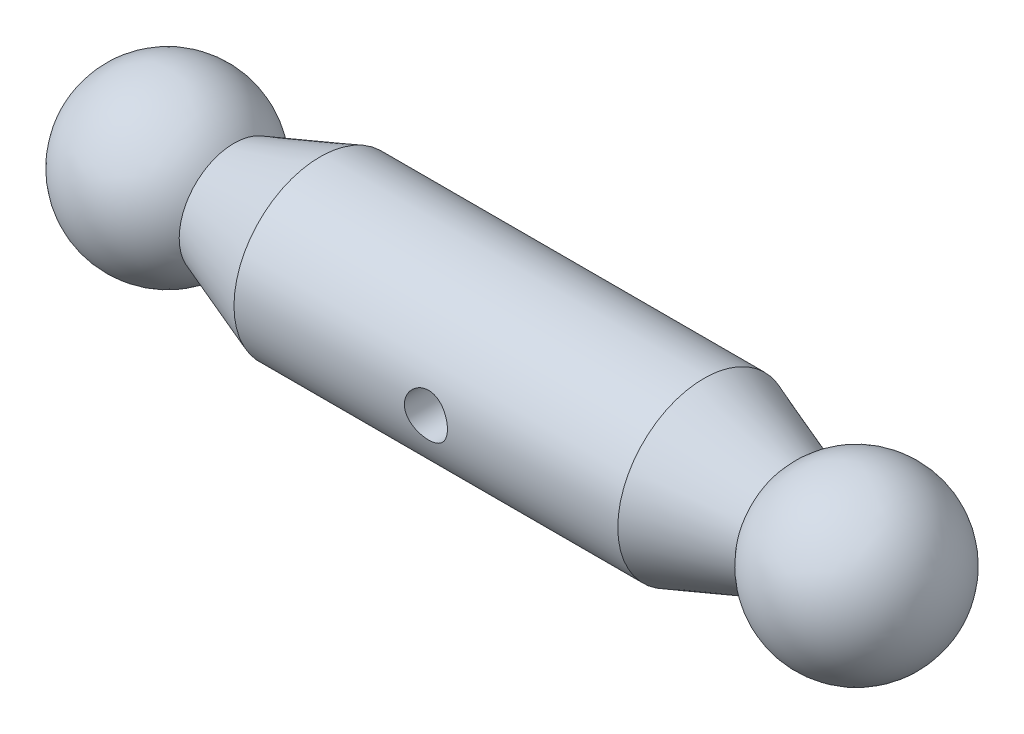
ISO-10303-21;
HEADER;
FILE_DESCRIPTION(('STEP AP214'),'2;1');
FILE_NAME('part.step','',(''),(''),'','','');
FILE_SCHEMA(('AUTOMOTIVE_DESIGN { 1 0 10303 214 1 1 1 1 }'));
ENDSEC;
DATA;
#1=APPLICATION_CONTEXT('core data for automotive mechanical design processes');
#2=APPLICATION_PROTOCOL_DEFINITION('international standard','automotive_design',2000,#1);
#3=PRODUCT_CONTEXT('',#1,'mechanical');
#4=PRODUCT('Part','Part','',(#3));
#5=PRODUCT_RELATED_PRODUCT_CATEGORY('part','',(#4));
#6=PRODUCT_DEFINITION_FORMATION('','',#4);
#7=PRODUCT_DEFINITION_CONTEXT('part definition',#1,'design');
#8=PRODUCT_DEFINITION('design','',#6,#7);
#9=PRODUCT_DEFINITION_SHAPE('','',#8);
#10=(LENGTH_UNIT() NAMED_UNIT(*) SI_UNIT(.MILLI.,.METRE.));
#11=(NAMED_UNIT(*) PLANE_ANGLE_UNIT() SI_UNIT($,.RADIAN.));
#12=(NAMED_UNIT(*) SI_UNIT($,.STERADIAN.) SOLID_ANGLE_UNIT());
#13=UNCERTAINTY_MEASURE_WITH_UNIT(LENGTH_MEASURE(1.E-05),#10,'distance_accuracy_value','');
#14=(GEOMETRIC_REPRESENTATION_CONTEXT(3) GLOBAL_UNCERTAINTY_ASSIGNED_CONTEXT((#13)) GLOBAL_UNIT_ASSIGNED_CONTEXT((#10,
#11,#12)) REPRESENTATION_CONTEXT('',''));
#15=CARTESIAN_POINT('',(0.,0.,0.));
#16=DIRECTION('',(0.,0.,1.));
#17=DIRECTION('',(1.,0.,0.));
#18=AXIS2_PLACEMENT_3D('',#15,#16,#17);
#19=CARTESIAN_POINT('',(-32.,0.,0.));
#20=DIRECTION('',(-1.,0.,0.));
#21=DIRECTION('',(0.,1.,0.));
#22=AXIS2_PLACEMENT_3D('',#19,#20,#21);
#23=SPHERICAL_SURFACE('',#22,8.);
#24=CARTESIAN_POINT('',(-25.8266838105894,0.,0.));
#25=DIRECTION('',(-1.,0.,0.));
#26=DIRECTION('',(0.,0.,1.));
#27=AXIS2_PLACEMENT_3D('',#24,#25,#26);
#28=CIRCLE('',#27,5.08823812587038);
#29=CARTESIAN_POINT('',(-25.8266838105894,0.,5.08823812587038));
#30=VERTEX_POINT('',#29);
#31=EDGE_CURVE('E395',#30,#30,#28,.T.);
#32=ORIENTED_EDGE('',*,*,#31,.T.);
#33=EDGE_LOOP('',(#32));
#34=FACE_BOUND('',#33,.T.);
#35=ADVANCED_FACE('F346',(#34),#23,.T.);
#36=CARTESIAN_POINT('',(32.,0.,0.));
#37=DIRECTION('',(-1.,0.,0.));
#38=DIRECTION('',(0.,-1.,0.));
#39=AXIS2_PLACEMENT_3D('',#36,#37,#38);
#40=SPHERICAL_SURFACE('',#39,8.);
#41=CARTESIAN_POINT('',(25.8266838105894,0.,0.));
#42=DIRECTION('',(-1.,0.,0.));
#43=DIRECTION('',(0.,0.,1.));
#44=AXIS2_PLACEMENT_3D('',#41,#42,#43);
#45=CIRCLE('',#44,5.08823812587038);
#46=CARTESIAN_POINT('',(25.8266838105894,0.,5.08823812587038));
#47=VERTEX_POINT('',#46);
#48=EDGE_CURVE('E10',#47,#47,#45,.T.);
#49=ORIENTED_EDGE('',*,*,#48,.F.);
#50=EDGE_LOOP('',(#49));
#51=FACE_BOUND('',#50,.T.);
#52=ADVANCED_FACE('F389',(#51),#40,.T.);
#53=CARTESIAN_POINT('',(25.8266838105894,0.,0.));
#54=DIRECTION('',(-1.,0.,0.));
#55=DIRECTION('',(0.,0.,1.));
#56=AXIS2_PLACEMENT_3D('',#53,#54,#55);
#57=CONICAL_SURFACE('',#56,5.08823812587038,0.349065850398867);
#58=CARTESIAN_POINT('',(17.8266838105894,0.,0.));
#59=DIRECTION('',(-1.,0.,0.));
#60=DIRECTION('',(0.,0.,1.));
#61=AXIS2_PLACEMENT_3D('',#58,#59,#60);
#62=CIRCLE('',#61,8.00000000000001);
#63=CARTESIAN_POINT('',(17.8266838105894,0.,8.00000000000001));
#64=VERTEX_POINT('',#63);
#65=EDGE_CURVE('E357',#64,#64,#62,.T.);
#66=ORIENTED_EDGE('',*,*,#65,.F.);
#67=EDGE_LOOP('',(#66));
#68=FACE_BOUND('',#67,.T.);
#69=ORIENTED_EDGE('',*,*,#48,.T.);
#70=EDGE_LOOP('',(#69));
#71=FACE_BOUND('',#70,.T.);
#72=ADVANCED_FACE('F384',(#68,#71),#57,.T.);
#73=CARTESIAN_POINT('',(-66.1293467336683,0.,0.));
#74=DIRECTION('',(-1.,0.,0.));
#75=DIRECTION('',(0.,0.,1.));
#76=AXIS2_PLACEMENT_3D('',#73,#74,#75);
#77=CYLINDRICAL_SURFACE('',#76,8.00000000000001);
#78=CARTESIAN_POINT('',(2.,0.,8.00000000000001));
#79=CARTESIAN_POINT('',(1.99999689901579,-0.110501451559641,7.9999981315735));
#80=CARTESIAN_POINT('',(1.99081126563495,-0.221037543774351,7.99768770842436));
#81=CARTESIAN_POINT('',(1.95436646492399,-0.438941765027377,7.98869485106526));
#82=CARTESIAN_POINT('',(1.92709705394953,-0.546308062494319,7.98200993893302));
#83=CARTESIAN_POINT('',(1.85541432871722,-0.754694496243436,7.96500835109377));
#84=CARTESIAN_POINT('',(1.81102160171297,-0.855722084573336,7.95469603789412));
#85=CARTESIAN_POINT('',(1.70642481327354,-1.04889617587257,7.93153791743496));
#86=CARTESIAN_POINT('',(1.64622021850804,-1.14104237913168,7.91869202472209));
#87=CARTESIAN_POINT('',(1.51039894712776,-1.31573590306789,7.89156551455592));
#88=CARTESIAN_POINT('',(1.43451790005459,-1.39807425341474,7.87726276197502));
#89=CARTESIAN_POINT('',(1.27006372678795,-1.54899856960443,7.84898160157249));
#90=CARTESIAN_POINT('',(1.18148916940408,-1.61758298259892,7.83500323053157));
#91=CARTESIAN_POINT('',(0.992539697684012,-1.74003539039863,7.80873034264225));
#92=CARTESIAN_POINT('',(0.892009025588362,-1.79366962123352,7.79646392619749));
#93=CARTESIAN_POINT('',(0.683002117786619,-1.88319587806766,7.77532659757356));
#94=CARTESIAN_POINT('',(0.574527155557313,-1.91909074058685,7.76645514259225));
#95=CARTESIAN_POINT('',(0.355008669064454,-1.97140644907302,7.75333968928431));
#96=CARTESIAN_POINT('',(0.24406013861601,-1.98820302444274,7.74900654662682));
#97=CARTESIAN_POINT('',(0.0208419080008726,-2.00301570008854,7.74519149946123));
#98=CARTESIAN_POINT('',(-0.0914275742561829,-2.00103485575748,7.74570880570572));
#99=CARTESIAN_POINT('',(-0.311221076993804,-1.97864869951961,7.75145607355757));
#100=CARTESIAN_POINT('',(-0.418794161953774,-1.95869112025418,7.75657150676392));
#101=CARTESIAN_POINT('',(-0.629014734548078,-1.90163224920399,7.77075612894759));
#102=CARTESIAN_POINT('',(-0.731661870705229,-1.86452973609252,7.77982559958985));
#103=CARTESIAN_POINT('',(-0.93031735500284,-1.77385263724958,7.80100151874213));
#104=CARTESIAN_POINT('',(-1.02624822905276,-1.72011555631056,7.81313769959755));
#105=CARTESIAN_POINT('',(-1.20789161300909,-1.59780836801993,7.83906281127989));
#106=CARTESIAN_POINT('',(-1.29360233075634,-1.52923566507845,7.85285203112838));
#107=CARTESIAN_POINT('',(-1.45493815425921,-1.37688456624163,7.88101174053189));
#108=CARTESIAN_POINT('',(-1.53020598674847,-1.29272834422115,7.89538759304002));
#109=CARTESIAN_POINT('',(-1.6656283232852,-1.11281589000493,7.92274620771676));
#110=CARTESIAN_POINT('',(-1.72578236568475,-1.01705930361059,7.93572892732544));
#111=CARTESIAN_POINT('',(-1.82940078163251,-0.816154518241855,7.95890309458921));
#112=CARTESIAN_POINT('',(-1.87280712033924,-0.710975190944831,7.96908480170304));
#113=CARTESIAN_POINT('',(-1.94122307427943,-0.49450134419051,7.98543889321889));
#114=CARTESIAN_POINT('',(-1.96623620855752,-0.383207998867313,7.99161204452374));
#115=CARTESIAN_POINT('',(-1.99661008741178,-0.160719960520035,7.99913999028501));
#116=CARTESIAN_POINT('',(-2.0024573681004,-0.0495956266509458,8.00061404677706));
#117=CARTESIAN_POINT('',(-1.99566799725935,0.172043833068678,7.99891739752602));
#118=CARTESIAN_POINT('',(-1.98303300960116,0.282559012859461,7.99574710989129));
#119=CARTESIAN_POINT('',(-1.94003878881149,0.498152358368656,7.98519441503143));
#120=CARTESIAN_POINT('',(-1.90994498203068,0.603286825291673,7.97787512247749));
#121=CARTESIAN_POINT('',(-1.83319055462874,0.807009723270016,7.95984942178846));
#122=CARTESIAN_POINT('',(-1.78652826091577,0.905597492043513,7.94914267159857));
#123=CARTESIAN_POINT('',(-1.6770184948337,1.0953641792398,7.92524410568415));
#124=CARTESIAN_POINT('',(-1.61389851680432,1.18638058911444,7.91201156489244));
#125=CARTESIAN_POINT('',(-1.47361345493737,1.35670215152433,7.88459345583227));
#126=CARTESIAN_POINT('',(-1.39644594717746,1.43600527863068,7.87040772335607));
#127=CARTESIAN_POINT('',(-1.22799738554071,1.58265409076364,7.84225275947695));
#128=CARTESIAN_POINT('',(-1.13641639599677,1.64965849016271,7.82829738916375));
#129=CARTESIAN_POINT('',(-0.943023154045709,1.7673476786836,7.80257171169652));
#130=CARTESIAN_POINT('',(-0.841211356053661,1.81803319221058,7.79080130756036));
#131=CARTESIAN_POINT('',(-0.630792370115895,1.90126856081239,7.77090792979554));
#132=CARTESIAN_POINT('',(-0.522229828874654,1.93392586220542,7.76276340389208));
#133=CARTESIAN_POINT('',(-0.300920482814521,1.98046087993837,7.75102325453579));
#134=CARTESIAN_POINT('',(-0.188174598623345,1.99434270330488,7.74742663626582));
#135=CARTESIAN_POINT('',(0.0348280318069375,2.00271812044533,7.7452653493861));
#136=CARTESIAN_POINT('',(0.145063246832974,1.99775719704016,7.74655910304352));
#137=CARTESIAN_POINT('',(0.363071851557308,1.96983637108382,7.75370545343791));
#138=CARTESIAN_POINT('',(0.470845290684868,1.94687683024903,7.7595579585581));
#139=CARTESIAN_POINT('',(0.680277945420545,1.88390842592373,7.77508347576964));
#140=CARTESIAN_POINT('',(0.781969740320278,1.84400187290717,7.78473353648413));
#141=CARTESIAN_POINT('',(0.977287176951586,1.74835321814009,7.80677007633106));
#142=CARTESIAN_POINT('',(1.07091169758256,1.69260892004558,7.81915693494365));
#143=CARTESIAN_POINT('',(1.25007283866936,1.56515699818285,7.8456751235135));
#144=CARTESIAN_POINT('',(1.33533476456528,1.493070883883,7.8598435310901));
#145=CARTESIAN_POINT('',(1.49272939306054,1.33571916158631,7.88810702995048));
#146=CARTESIAN_POINT('',(1.56485897348396,1.25045042834819,7.90220210302747));
#147=CARTESIAN_POINT('',(1.69521507808614,1.06729011560345,7.92903540863551));
#148=CARTESIAN_POINT('',(1.75316615156211,0.969197896421848,7.94174444487825));
#149=CARTESIAN_POINT('',(1.85166328392071,0.764354746013967,7.96406566633492));
#150=CARTESIAN_POINT('',(1.89222181419805,0.657610084582318,7.97368006933042));
#151=CARTESIAN_POINT('',(1.94876244043954,0.459213670991294,7.98730746087389));
#152=CARTESIAN_POINT('',(1.96793499073791,0.36850689454409,7.99203446736921));
#153=CARTESIAN_POINT('',(1.99355459149592,0.18520809538171,7.99838140309265));
#154=CARTESIAN_POINT('',(2.00000259907373,0.0926162149901548,8.00000156601193));
#155=CARTESIAN_POINT('',(2.,0.,8.00000000000001));
#156=B_SPLINE_CURVE_WITH_KNOTS('',3,(#78,#79,#80,#81,#82,#83,#84,#85,#86,#87,#88,#89,#90,#91,
#92,#93,#94,#95,#96,#97,#98,#99,#100,#101,#102,#103,#104,#105,#106,#107,#108,#109,#110,#111,
#112,#113,#114,#115,#116,#117,#118,#119,#120,#121,#122,#123,#124,#125,#126,#127,#128,#129,#130,
#131,#132,#133,#134,#135,#136,#137,#138,#139,#140,#141,#142,#143,#144,#145,#146,#147,#148,#149,
#150,#151,#152,#153,#154,#155),.UNSPECIFIED.,.T.,.F.,(4,2,2,2,2,2,2,2,2,2,2,2,2,2,2,2,2,2,2,2,2,
2,2,2,2,2,2,2,2,2,2,2,2,2,2,2,2,2,4),(0.,0.33116494996252,0.662517650351866,0.993473203048141,
1.32443992022577,1.66152580582852,1.99864972773416,2.34078196727742,2.68285948225824,
3.01808393468093,3.3532538415469,3.68029996013785,4.00736937959146,4.337740371696,
4.66816921119311,5.00802001296454,5.34788119415424,5.6889097201658,6.02987298255951,
6.36211078603463,6.69431868154751,7.02160366023144,7.34892169767481,7.68204783424897,
8.01523150681786,8.35659345610395,8.69794025003772,9.03723006156476,9.37644564340971,
9.70591707202577,10.0353818794581,10.3628853408369,10.6904342418696,11.0265276855097,
11.3627009303165,11.7049624733721,12.0469781843289,12.3245632392729,12.6021274139515),.UNSPECIFIED.);
#157=CARTESIAN_POINT('',(2.,0.,8.00000000000001));
#158=VERTEX_POINT('',#157);
#159=EDGE_CURVE('E349',#158,#158,#156,.T.);
#160=ORIENTED_EDGE('',*,*,#159,.T.);
#161=EDGE_LOOP('',(#160));
#162=FACE_BOUND('',#161,.T.);
#163=CARTESIAN_POINT('',(2.,0.,-8.00000000000001));
#164=CARTESIAN_POINT('',(1.99999689901579,0.110501451559641,-7.9999981315735));
#165=CARTESIAN_POINT('',(1.99081126563495,0.221037543774351,-7.99768770842436));
#166=CARTESIAN_POINT('',(1.95436646492399,0.438941765027377,-7.98869485106526));
#167=CARTESIAN_POINT('',(1.92709705394953,0.546308062494319,-7.98200993893302));
#168=CARTESIAN_POINT('',(1.85541432871722,0.754694496243436,-7.96500835109377));
#169=CARTESIAN_POINT('',(1.81102160171297,0.855722084573336,-7.95469603789412));
#170=CARTESIAN_POINT('',(1.70642481327354,1.04889617587257,-7.93153791743496));
#171=CARTESIAN_POINT('',(1.64622021850804,1.14104237913168,-7.91869202472209));
#172=CARTESIAN_POINT('',(1.51039894712776,1.31573590306789,-7.89156551455592));
#173=CARTESIAN_POINT('',(1.43451790005459,1.39807425341474,-7.87726276197502));
#174=CARTESIAN_POINT('',(1.27006372678795,1.54899856960443,-7.84898160157249));
#175=CARTESIAN_POINT('',(1.18148916940408,1.61758298259892,-7.83500323053157));
#176=CARTESIAN_POINT('',(0.992539697684012,1.74003539039863,-7.80873034264225));
#177=CARTESIAN_POINT('',(0.892009025588362,1.79366962123352,-7.79646392619749));
#178=CARTESIAN_POINT('',(0.683002117786619,1.88319587806766,-7.77532659757356));
#179=CARTESIAN_POINT('',(0.574527155557313,1.91909074058685,-7.76645514259225));
#180=CARTESIAN_POINT('',(0.355008669064454,1.97140644907302,-7.75333968928431));
#181=CARTESIAN_POINT('',(0.24406013861601,1.98820302444274,-7.74900654662682));
#182=CARTESIAN_POINT('',(0.0208419080008726,2.00301570008854,-7.74519149946123));
#183=CARTESIAN_POINT('',(-0.0914275742561829,2.00103485575748,-7.74570880570572));
#184=CARTESIAN_POINT('',(-0.311221076993804,1.97864869951961,-7.75145607355757));
#185=CARTESIAN_POINT('',(-0.418794161953774,1.95869112025418,-7.75657150676392));
#186=CARTESIAN_POINT('',(-0.629014734548078,1.90163224920399,-7.77075612894759));
#187=CARTESIAN_POINT('',(-0.731661870705229,1.86452973609252,-7.77982559958985));
#188=CARTESIAN_POINT('',(-0.93031735500284,1.77385263724958,-7.80100151874213));
#189=CARTESIAN_POINT('',(-1.02624822905276,1.72011555631056,-7.81313769959755));
#190=CARTESIAN_POINT('',(-1.20789161300909,1.59780836801993,-7.83906281127989));
#191=CARTESIAN_POINT('',(-1.29360233075634,1.52923566507845,-7.85285203112838));
#192=CARTESIAN_POINT('',(-1.45493815425921,1.37688456624163,-7.88101174053189));
#193=CARTESIAN_POINT('',(-1.53020598674847,1.29272834422115,-7.89538759304002));
#194=CARTESIAN_POINT('',(-1.6656283232852,1.11281589000493,-7.92274620771676));
#195=CARTESIAN_POINT('',(-1.72578236568475,1.01705930361059,-7.93572892732544));
#196=CARTESIAN_POINT('',(-1.82940078163251,0.816154518241855,-7.95890309458921));
#197=CARTESIAN_POINT('',(-1.87280712033924,0.710975190944831,-7.96908480170304));
#198=CARTESIAN_POINT('',(-1.94122307427943,0.49450134419051,-7.98543889321889));
#199=CARTESIAN_POINT('',(-1.96623620855752,0.383207998867313,-7.99161204452374));
#200=CARTESIAN_POINT('',(-1.99661008741178,0.160719960520035,-7.99913999028501));
#201=CARTESIAN_POINT('',(-2.0024573681004,0.0495956266509458,-8.00061404677706));
#202=CARTESIAN_POINT('',(-1.99566799725935,-0.172043833068678,-7.99891739752602));
#203=CARTESIAN_POINT('',(-1.98303300960116,-0.282559012859461,-7.99574710989129));
#204=CARTESIAN_POINT('',(-1.94003878881149,-0.498152358368656,-7.98519441503143));
#205=CARTESIAN_POINT('',(-1.90994498203068,-0.603286825291673,-7.97787512247749));
#206=CARTESIAN_POINT('',(-1.83319055462874,-0.807009723270016,-7.95984942178846));
#207=CARTESIAN_POINT('',(-1.78652826091577,-0.905597492043513,-7.94914267159857));
#208=CARTESIAN_POINT('',(-1.6770184948337,-1.0953641792398,-7.92524410568415));
#209=CARTESIAN_POINT('',(-1.61389851680432,-1.18638058911444,-7.91201156489244));
#210=CARTESIAN_POINT('',(-1.47361345493737,-1.35670215152433,-7.88459345583227));
#211=CARTESIAN_POINT('',(-1.39644594717746,-1.43600527863068,-7.87040772335607));
#212=CARTESIAN_POINT('',(-1.22799738554071,-1.58265409076364,-7.84225275947695));
#213=CARTESIAN_POINT('',(-1.13641639599677,-1.64965849016271,-7.82829738916375));
#214=CARTESIAN_POINT('',(-0.943023154045709,-1.7673476786836,-7.80257171169652));
#215=CARTESIAN_POINT('',(-0.841211356053661,-1.81803319221058,-7.79080130756036));
#216=CARTESIAN_POINT('',(-0.630792370115895,-1.90126856081239,-7.77090792979554));
#217=CARTESIAN_POINT('',(-0.522229828874654,-1.93392586220542,-7.76276340389208));
#218=CARTESIAN_POINT('',(-0.300920482814521,-1.98046087993837,-7.75102325453579));
#219=CARTESIAN_POINT('',(-0.188174598623345,-1.99434270330488,-7.74742663626582));
#220=CARTESIAN_POINT('',(0.0348280318069375,-2.00271812044533,-7.7452653493861));
#221=CARTESIAN_POINT('',(0.145063246832974,-1.99775719704016,-7.74655910304352));
#222=CARTESIAN_POINT('',(0.363071851557308,-1.96983637108382,-7.75370545343791));
#223=CARTESIAN_POINT('',(0.470845290684868,-1.94687683024903,-7.7595579585581));
#224=CARTESIAN_POINT('',(0.680277945420545,-1.88390842592373,-7.77508347576964));
#225=CARTESIAN_POINT('',(0.781969740320278,-1.84400187290717,-7.78473353648413));
#226=CARTESIAN_POINT('',(0.977287176951586,-1.74835321814009,-7.80677007633106));
#227=CARTESIAN_POINT('',(1.07091169758256,-1.69260892004558,-7.81915693494365));
#228=CARTESIAN_POINT('',(1.25007283866936,-1.56515699818285,-7.8456751235135));
#229=CARTESIAN_POINT('',(1.33533476456528,-1.493070883883,-7.8598435310901));
#230=CARTESIAN_POINT('',(1.49272939306054,-1.33571916158631,-7.88810702995048));
#231=CARTESIAN_POINT('',(1.56485897348396,-1.25045042834819,-7.90220210302747));
#232=CARTESIAN_POINT('',(1.69521507808614,-1.06729011560345,-7.92903540863551));
#233=CARTESIAN_POINT('',(1.75316615156211,-0.969197896421848,-7.94174444487825));
#234=CARTESIAN_POINT('',(1.85166328392071,-0.764354746013967,-7.96406566633492));
#235=CARTESIAN_POINT('',(1.89222181419805,-0.657610084582318,-7.97368006933042));
#236=CARTESIAN_POINT('',(1.94876244043954,-0.459213670991294,-7.98730746087389));
#237=CARTESIAN_POINT('',(1.96793499073791,-0.36850689454409,-7.99203446736921));
#238=CARTESIAN_POINT('',(1.99355459149592,-0.18520809538171,-7.99838140309265));
#239=CARTESIAN_POINT('',(2.00000259907373,-0.0926162149901548,-8.00000156601193));
#240=CARTESIAN_POINT('',(2.,0.,-8.00000000000001));
#241=B_SPLINE_CURVE_WITH_KNOTS('',3,(#163,#164,#165,#166,#167,#168,#169,#170,#171,#172,#173,
#174,#175,#176,#177,#178,#179,#180,#181,#182,#183,#184,#185,#186,#187,#188,#189,#190,#191,#192,
#193,#194,#195,#196,#197,#198,#199,#200,#201,#202,#203,#204,#205,#206,#207,#208,#209,#210,#211,
#212,#213,#214,#215,#216,#217,#218,#219,#220,#221,#222,#223,#224,#225,#226,#227,#228,#229,#230,
#231,#232,#233,#234,#235,#236,#237,#238,#239,#240),.UNSPECIFIED.,.T.,.F.,(4,2,2,2,2,2,2,2,2,2,2,
2,2,2,2,2,2,2,2,2,2,2,2,2,2,2,2,2,2,2,2,2,2,2,2,2,2,2,4),(0.,0.33116494996252,0.662517650351866,
0.993473203048141,1.32443992022577,1.66152580582852,1.99864972773416,2.34078196727742,
2.68285948225824,3.01808393468093,3.3532538415469,3.68029996013785,4.00736937959146,
4.337740371696,4.66816921119311,5.00802001296454,5.34788119415424,5.6889097201658,
6.02987298255951,6.36211078603463,6.69431868154751,7.02160366023144,7.34892169767481,
7.68204783424897,8.01523150681786,8.35659345610395,8.69794025003772,9.03723006156476,
9.37644564340971,9.70591707202577,10.0353818794581,10.3628853408369,10.6904342418696,
11.0265276855097,11.3627009303165,11.7049624733721,12.0469781843289,12.3245632392729,
12.6021274139515),.UNSPECIFIED.);
#242=CARTESIAN_POINT('',(2.,0.,-8.00000000000001));
#243=VERTEX_POINT('',#242);
#244=EDGE_CURVE('E365',#243,#243,#241,.T.);
#245=ORIENTED_EDGE('',*,*,#244,.T.);
#246=EDGE_LOOP('',(#245));
#247=FACE_BOUND('',#246,.T.);
#248=CARTESIAN_POINT('',(-17.8266838105894,0.,0.));
#249=DIRECTION('',(-1.,0.,0.));
#250=DIRECTION('',(0.,0.,1.));
#251=AXIS2_PLACEMENT_3D('',#248,#249,#250);
#252=CIRCLE('',#251,8.00000000000001);
#253=CARTESIAN_POINT('',(-17.8266838105894,0.,8.00000000000001));
#254=VERTEX_POINT('',#253);
#255=EDGE_CURVE('E362',#254,#254,#252,.T.);
#256=ORIENTED_EDGE('',*,*,#255,.F.);
#257=EDGE_LOOP('',(#256));
#258=FACE_BOUND('',#257,.T.);
#259=ORIENTED_EDGE('',*,*,#65,.T.);
#260=EDGE_LOOP('',(#259));
#261=FACE_BOUND('',#260,.T.);
#262=ADVANCED_FACE('F369',(#162,#247,#258,#261),#77,.T.);
#263=CARTESIAN_POINT('',(-17.8266838105894,0.,0.));
#264=DIRECTION('',(1.,0.,0.));
#265=DIRECTION('',(0.,0.,-1.));
#266=AXIS2_PLACEMENT_3D('',#263,#264,#265);
#267=CONICAL_SURFACE('',#266,8.00000000000001,0.349065850398867);
#268=ORIENTED_EDGE('',*,*,#31,.F.);
#269=EDGE_LOOP('',(#268));
#270=FACE_BOUND('',#269,.T.);
#271=ORIENTED_EDGE('',*,*,#255,.T.);
#272=EDGE_LOOP('',(#271));
#273=FACE_BOUND('',#272,.T.);
#274=ADVANCED_FACE('F376',(#270,#273),#267,.T.);
#275=CARTESIAN_POINT('',(0.,0.,-20.));
#276=DIRECTION('',(0.,0.,1.));
#277=DIRECTION('',(1.,0.,0.));
#278=AXIS2_PLACEMENT_3D('',#275,#276,#277);
#279=CYLINDRICAL_SURFACE('',#278,2.);
#280=ORIENTED_EDGE('',*,*,#244,.F.);
#281=EDGE_LOOP('',(#280));
#282=FACE_BOUND('',#281,.T.);
#283=ORIENTED_EDGE('',*,*,#159,.F.);
#284=EDGE_LOOP('',(#283));
#285=FACE_BOUND('',#284,.T.);
#286=ADVANCED_FACE('F373',(#282,#285),#279,.F.);
#287=CLOSED_SHELL('',(#35,#52,#72,#262,#274,#286));
#288=MANIFOLD_SOLID_BREP('B2',#287);
#289=ADVANCED_BREP_SHAPE_REPRESENTATION('',(#18,#288),#14);
#290=SHAPE_DEFINITION_REPRESENTATION(#9,#289);
ENDSEC;
END-ISO-10303-21;
